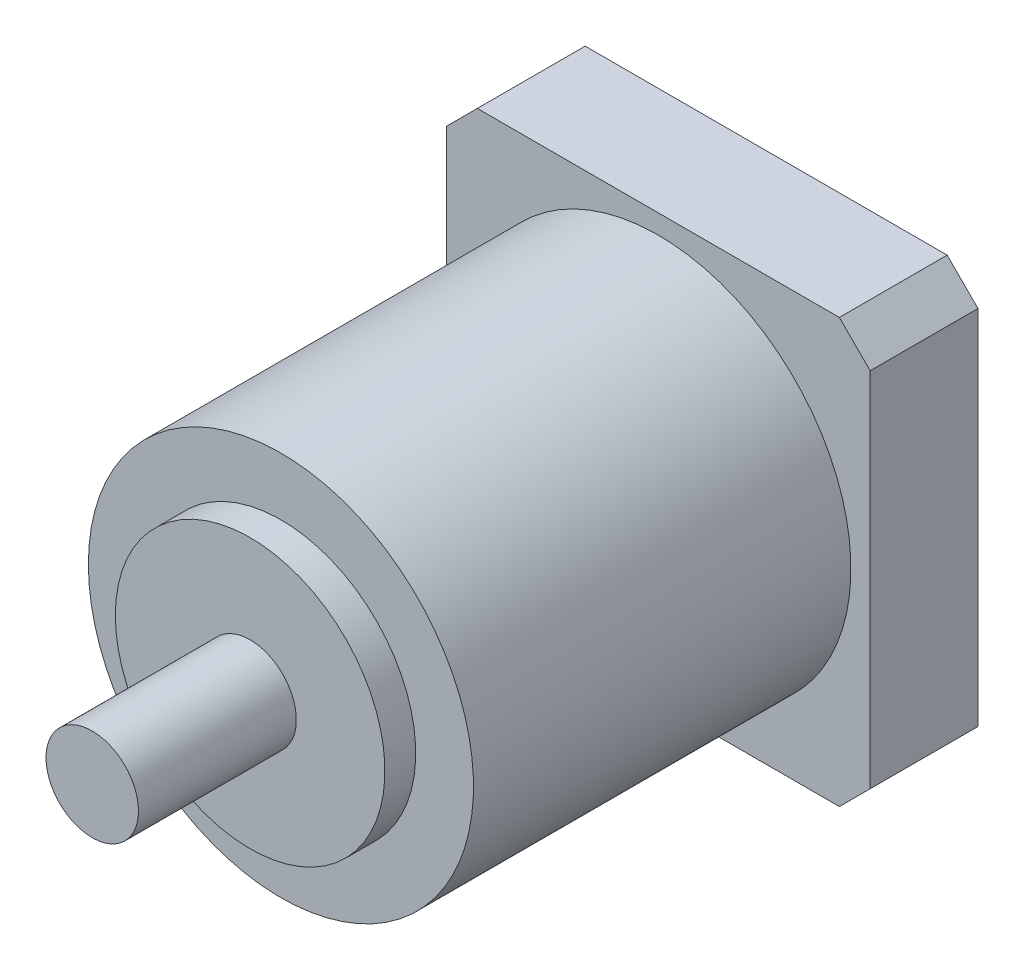
ISO-10303-21;
HEADER;
FILE_DESCRIPTION(('STEP AP214'),'2;1');
FILE_NAME('part.step','',(''),(''),'','','');
FILE_SCHEMA(('AUTOMOTIVE_DESIGN { 1 0 10303 214 1 1 1 1 }'));
ENDSEC;
DATA;
#1=APPLICATION_CONTEXT('core data for automotive mechanical design processes');
#2=APPLICATION_PROTOCOL_DEFINITION('international standard','automotive_design',2000,#1);
#3=PRODUCT_CONTEXT('',#1,'mechanical');
#4=PRODUCT('Part','Part','',(#3));
#5=PRODUCT_RELATED_PRODUCT_CATEGORY('part','',(#4));
#6=PRODUCT_DEFINITION_FORMATION('','',#4);
#7=PRODUCT_DEFINITION_CONTEXT('part definition',#1,'design');
#8=PRODUCT_DEFINITION('design','',#6,#7);
#9=PRODUCT_DEFINITION_SHAPE('','',#8);
#10=(LENGTH_UNIT() NAMED_UNIT(*) SI_UNIT(.MILLI.,.METRE.));
#11=(NAMED_UNIT(*) PLANE_ANGLE_UNIT() SI_UNIT($,.RADIAN.));
#12=(NAMED_UNIT(*) SI_UNIT($,.STERADIAN.) SOLID_ANGLE_UNIT());
#13=UNCERTAINTY_MEASURE_WITH_UNIT(LENGTH_MEASURE(1.E-05),#10,'distance_accuracy_value','');
#14=(GEOMETRIC_REPRESENTATION_CONTEXT(3) GLOBAL_UNCERTAINTY_ASSIGNED_CONTEXT((#13)) GLOBAL_UNIT_ASSIGNED_CONTEXT((#10,
#11,#12)) REPRESENTATION_CONTEXT('',''));
#15=CARTESIAN_POINT('',(0.,0.,0.));
#16=DIRECTION('',(0.,0.,1.));
#17=DIRECTION('',(1.,0.,0.));
#18=AXIS2_PLACEMENT_3D('',#15,#16,#17);
#19=CARTESIAN_POINT('',(0.,0.,-42.));
#20=DIRECTION('',(0.,0.,1.));
#21=DIRECTION('',(1.,0.,0.));
#22=AXIS2_PLACEMENT_3D('',#19,#20,#21);
#23=PLANE('',#22);
#24=CARTESIAN_POINT('',(0.,0.,-42.));
#25=DIRECTION('',(0.,0.,1.));
#26=DIRECTION('',(1.,0.,0.));
#27=AXIS2_PLACEMENT_3D('',#24,#25,#26);
#28=CIRCLE('',#27,4.5);
#29=CARTESIAN_POINT('',(4.5,0.,-42.));
#30=VERTEX_POINT('',#29);
#31=EDGE_CURVE('P0_E20',#30,#30,#28,.F.);
#32=ORIENTED_EDGE('',*,*,#31,.T.);
#33=EDGE_LOOP('',(#32));
#34=FACE_BOUND('',#33,.T.);
#35=ADVANCED_FACE('P0_F17',(#34),#23,.F.);
#36=CARTESIAN_POINT('',(0.,0.,-64.05));
#37=DIRECTION('',(0.,0.,1.));
#38=DIRECTION('',(1.,0.,0.));
#39=AXIS2_PLACEMENT_3D('',#36,#37,#38);
#40=CYLINDRICAL_SURFACE('',#39,4.5);
#41=CARTESIAN_POINT('',(0.,0.,-60.));
#42=DIRECTION('',(0.,0.,1.));
#43=DIRECTION('',(1.,0.,0.));
#44=AXIS2_PLACEMENT_3D('',#41,#42,#43);
#45=CIRCLE('',#44,4.5);
#46=CARTESIAN_POINT('',(4.5,0.,-60.));
#47=VERTEX_POINT('',#46);
#48=EDGE_CURVE('P0_E145',#47,#47,#45,.F.);
#49=ORIENTED_EDGE('',*,*,#48,.T.);
#50=EDGE_LOOP('',(#49));
#51=FACE_BOUND('',#50,.T.);
#52=ORIENTED_EDGE('',*,*,#31,.F.);
#53=EDGE_LOOP('',(#52));
#54=FACE_BOUND('',#53,.T.);
#55=ADVANCED_FACE('P0_F153',(#51,#54),#40,.F.);
#56=CARTESIAN_POINT('',(0.,0.,24.5));
#57=DIRECTION('',(0.,0.,-1.));
#58=DIRECTION('',(-1.,0.,0.));
#59=AXIS2_PLACEMENT_3D('',#56,#57,#58);
#60=PLANE('',#59);
#61=CARTESIAN_POINT('',(0.,0.,24.5));
#62=DIRECTION('',(0.,0.,-1.));
#63=DIRECTION('',(-1.,0.,0.));
#64=AXIS2_PLACEMENT_3D('',#61,#62,#63);
#65=CIRCLE('',#64,6.);
#66=CARTESIAN_POINT('',(-6.,0.,24.5));
#67=VERTEX_POINT('',#66);
#68=EDGE_CURVE('P0_E109',#67,#67,#65,.T.);
#69=ORIENTED_EDGE('',*,*,#68,.F.);
#70=EDGE_LOOP('',(#69));
#71=FACE_BOUND('',#70,.T.);
#72=ADVANCED_FACE('P0_F155',(#71),#60,.F.);
#73=CARTESIAN_POINT('',(0.,0.,-60.));
#74=DIRECTION('',(0.,0.,1.));
#75=DIRECTION('',(1.,0.,0.));
#76=AXIS2_PLACEMENT_3D('',#73,#74,#75);
#77=PLANE('',#76);
#78=ORIENTED_EDGE('',*,*,#48,.F.);
#79=EDGE_LOOP('',(#78));
#80=FACE_BOUND('',#79,.T.);
#81=CARTESIAN_POINT('',(0.,0.,-60.));
#82=DIRECTION('',(0.,0.,1.));
#83=DIRECTION('',(1.,0.,0.));
#84=AXIS2_PLACEMENT_3D('',#81,#82,#83);
#85=CIRCLE('',#84,20.5);
#86=CARTESIAN_POINT('',(20.5,0.,-60.));
#87=VERTEX_POINT('',#86);
#88=EDGE_CURVE('P0_E103',#87,#87,#85,.F.);
#89=ORIENTED_EDGE('',*,*,#88,.T.);
#90=EDGE_LOOP('',(#89));
#91=FACE_BOUND('',#90,.T.);
#92=ADVANCED_FACE('P0_F96',(#80,#91),#77,.F.);
#93=CARTESIAN_POINT('',(-22.27386360738,22.27386360738,-54.0000000000305));
#94=DIRECTION('',(0.,0.,-1.));
#95=DIRECTION('',(0.,1.,0.));
#96=AXIS2_PLACEMENT_3D('',#93,#94,#95);
#97=CONICAL_SURFACE('',#96,1.5999999999949,1.0297442586517);
#98=CARTESIAN_POINT('',(-22.2738636073245,22.27386360738,-53.0386230095985));
#99=VERTEX_POINT('',#98);
#100=VERTEX_LOOP('',#99);
#101=FACE_BOUND('',#100,.T.);
#102=CARTESIAN_POINT('',(-22.27386360738,22.27386360738,-54.));
#103=DIRECTION('',(0.,0.,-1.));
#104=DIRECTION('',(-1.,0.,0.));
#105=AXIS2_PLACEMENT_3D('',#102,#103,#104);
#106=CIRCLE('',#105,1.6);
#107=CARTESIAN_POINT('',(-23.87386360738,22.27386360738,-54.));
#108=VERTEX_POINT('',#107);
#109=EDGE_CURVE('P0_E100',#108,#108,#106,.T.);
#110=ORIENTED_EDGE('',*,*,#109,.T.);
#111=EDGE_LOOP('',(#110));
#112=FACE_BOUND('',#111,.T.);
#113=ADVANCED_FACE('P0_F92',(#101,#112),#97,.F.);
#114=CARTESIAN_POINT('',(22.27386360738,22.27386360738,-54.0000000000873));
#115=DIRECTION('',(0.,0.,-1.));
#116=DIRECTION('',(-1.,0.,0.));
#117=AXIS2_PLACEMENT_3D('',#114,#115,#116);
#118=CONICAL_SURFACE('',#117,1.5999999999408,1.02974425855395);
#119=CARTESIAN_POINT('',(22.2738636074382,22.27386360738,-53.0386230095985));
#120=VERTEX_POINT('',#119);
#121=VERTEX_LOOP('',#120);
#122=FACE_BOUND('',#121,.T.);
#123=CARTESIAN_POINT('',(22.27386360738,22.27386360738,-54.));
#124=DIRECTION('',(0.,0.,-1.));
#125=DIRECTION('',(-1.,0.,0.));
#126=AXIS2_PLACEMENT_3D('',#123,#124,#125);
#127=CIRCLE('',#126,1.6);
#128=CARTESIAN_POINT('',(20.67386360738,22.27386360738,-54.));
#129=VERTEX_POINT('',#128);
#130=EDGE_CURVE('P0_E102',#129,#129,#127,.T.);
#131=ORIENTED_EDGE('',*,*,#130,.T.);
#132=EDGE_LOOP('',(#131));
#133=FACE_BOUND('',#132,.T.);
#134=ADVANCED_FACE('P0_F95',(#122,#133),#118,.F.);
#135=CARTESIAN_POINT('',(22.27386360738,-22.27386360738,-54.0000000000873));
#136=DIRECTION('',(0.,0.,-1.));
#137=DIRECTION('',(-1.,0.,0.));
#138=AXIS2_PLACEMENT_3D('',#135,#136,#137);
#139=CONICAL_SURFACE('',#138,1.5999999999408,1.02974425855395);
#140=CARTESIAN_POINT('',(22.2738636074382,-22.27386360738,-53.0386230095985));
#141=VERTEX_POINT('',#140);
#142=VERTEX_LOOP('',#141);
#143=FACE_BOUND('',#142,.T.);
#144=CARTESIAN_POINT('',(22.27386360738,-22.27386360738,-54.));
#145=DIRECTION('',(0.,0.,-1.));
#146=DIRECTION('',(-1.,0.,0.));
#147=AXIS2_PLACEMENT_3D('',#144,#145,#146);
#148=CIRCLE('',#147,1.6);
#149=CARTESIAN_POINT('',(20.67386360738,-22.27386360738,-54.));
#150=VERTEX_POINT('',#149);
#151=EDGE_CURVE('P0_E106',#150,#150,#148,.T.);
#152=ORIENTED_EDGE('',*,*,#151,.T.);
#153=EDGE_LOOP('',(#152));
#154=FACE_BOUND('',#153,.T.);
#155=ADVANCED_FACE('P0_F248',(#143,#154),#139,.F.);
#156=CARTESIAN_POINT('',(-22.27386360738,-22.27386360738,-54.0000000000305));
#157=DIRECTION('',(0.,0.,-1.));
#158=DIRECTION('',(0.,1.,0.));
#159=AXIS2_PLACEMENT_3D('',#156,#157,#158);
#160=CONICAL_SURFACE('',#159,1.5999999999949,1.0297442586517);
#161=CARTESIAN_POINT('',(-22.2738636073245,-22.27386360738,-53.0386230095985));
#162=VERTEX_POINT('',#161);
#163=VERTEX_LOOP('',#162);
#164=FACE_BOUND('',#163,.T.);
#165=CARTESIAN_POINT('',(-22.27386360738,-22.27386360738,-54.));
#166=DIRECTION('',(0.,0.,-1.));
#167=DIRECTION('',(-1.,0.,0.));
#168=AXIS2_PLACEMENT_3D('',#165,#166,#167);
#169=CIRCLE('',#168,1.6);
#170=CARTESIAN_POINT('',(-23.87386360738,-22.27386360738,-54.));
#171=VERTEX_POINT('',#170);
#172=EDGE_CURVE('P0_E142',#171,#171,#169,.T.);
#173=ORIENTED_EDGE('',*,*,#172,.T.);
#174=EDGE_LOOP('',(#173));
#175=FACE_BOUND('',#174,.T.);
#176=ADVANCED_FACE('P0_F244',(#164,#175),#160,.F.);
#177=CARTESIAN_POINT('',(0.,0.,25.725));
#178=DIRECTION('',(0.,0.,-1.));
#179=DIRECTION('',(-1.,0.,0.));
#180=AXIS2_PLACEMENT_3D('',#177,#178,#179);
#181=CYLINDRICAL_SURFACE('',#180,6.);
#182=CARTESIAN_POINT('',(0.,0.,4.));
#183=DIRECTION('',(0.,0.,-1.));
#184=DIRECTION('',(-1.,0.,0.));
#185=AXIS2_PLACEMENT_3D('',#182,#183,#184);
#186=CIRCLE('',#185,6.);
#187=CARTESIAN_POINT('',(-6.,0.,4.));
#188=VERTEX_POINT('',#187);
#189=EDGE_CURVE('P0_E140',#188,#188,#186,.F.);
#190=ORIENTED_EDGE('',*,*,#189,.T.);
#191=EDGE_LOOP('',(#190));
#192=FACE_BOUND('',#191,.T.);
#193=ORIENTED_EDGE('',*,*,#68,.T.);
#194=EDGE_LOOP('',(#193));
#195=FACE_BOUND('',#194,.T.);
#196=ADVANCED_FACE('P0_F240',(#192,#195),#181,.T.);
#197=CARTESIAN_POINT('',(0.,0.,-64.05));
#198=DIRECTION('',(0.,0.,1.));
#199=DIRECTION('',(1.,0.,0.));
#200=AXIS2_PLACEMENT_3D('',#197,#198,#199);
#201=CYLINDRICAL_SURFACE('',#200,20.5);
#202=ORIENTED_EDGE('',*,*,#88,.F.);
#203=EDGE_LOOP('',(#202));
#204=FACE_BOUND('',#203,.T.);
#205=CARTESIAN_POINT('',(0.,0.,-63.));
#206=DIRECTION('',(0.,0.,1.));
#207=DIRECTION('',(1.,0.,0.));
#208=AXIS2_PLACEMENT_3D('',#205,#206,#207);
#209=CIRCLE('',#208,20.5);
#210=CARTESIAN_POINT('',(20.5,0.,-63.));
#211=VERTEX_POINT('',#210);
#212=EDGE_CURVE('P0_E137',#211,#211,#209,.T.);
#213=ORIENTED_EDGE('',*,*,#212,.F.);
#214=EDGE_LOOP('',(#213));
#215=FACE_BOUND('',#214,.T.);
#216=ADVANCED_FACE('P0_F237',(#204,#215),#201,.F.);
#217=CARTESIAN_POINT('',(-22.27386360738,22.27386360738,-52.54055416003));
#218=DIRECTION('',(0.,0.,-1.));
#219=DIRECTION('',(-1.,0.,0.));
#220=AXIS2_PLACEMENT_3D('',#217,#218,#219);
#221=CYLINDRICAL_SURFACE('',#220,1.6);
#222=ORIENTED_EDGE('',*,*,#109,.F.);
#223=EDGE_LOOP('',(#222));
#224=FACE_BOUND('',#223,.T.);
#225=CARTESIAN_POINT('',(-22.27386360738,22.27386360738,-63.));
#226=DIRECTION('',(0.,0.,-1.));
#227=DIRECTION('',(-1.,0.,0.));
#228=AXIS2_PLACEMENT_3D('',#225,#226,#227);
#229=CIRCLE('',#228,1.6);
#230=CARTESIAN_POINT('',(-23.87386360738,22.27386360738,-63.));
#231=VERTEX_POINT('',#230);
#232=EDGE_CURVE('P0_E134',#231,#231,#229,.F.);
#233=ORIENTED_EDGE('',*,*,#232,.F.);
#234=EDGE_LOOP('',(#233));
#235=FACE_BOUND('',#234,.T.);
#236=ADVANCED_FACE('P0_F233',(#224,#235),#221,.F.);
#237=CARTESIAN_POINT('',(22.27386360738,22.27386360738,-52.54055416003));
#238=DIRECTION('',(0.,0.,-1.));
#239=DIRECTION('',(-1.,0.,0.));
#240=AXIS2_PLACEMENT_3D('',#237,#238,#239);
#241=CYLINDRICAL_SURFACE('',#240,1.6);
#242=ORIENTED_EDGE('',*,*,#130,.F.);
#243=EDGE_LOOP('',(#242));
#244=FACE_BOUND('',#243,.T.);
#245=CARTESIAN_POINT('',(22.27386360738,22.27386360738,-63.));
#246=DIRECTION('',(0.,0.,-1.));
#247=DIRECTION('',(-1.,0.,0.));
#248=AXIS2_PLACEMENT_3D('',#245,#246,#247);
#249=CIRCLE('',#248,1.6);
#250=CARTESIAN_POINT('',(20.67386360738,22.27386360738,-63.));
#251=VERTEX_POINT('',#250);
#252=EDGE_CURVE('P0_E131',#251,#251,#249,.F.);
#253=ORIENTED_EDGE('',*,*,#252,.F.);
#254=EDGE_LOOP('',(#253));
#255=FACE_BOUND('',#254,.T.);
#256=ADVANCED_FACE('P0_F229',(#244,#255),#241,.F.);
#257=CARTESIAN_POINT('',(22.27386360738,-22.27386360738,-52.54055416003));
#258=DIRECTION('',(0.,0.,-1.));
#259=DIRECTION('',(-1.,0.,0.));
#260=AXIS2_PLACEMENT_3D('',#257,#258,#259);
#261=CYLINDRICAL_SURFACE('',#260,1.6);
#262=ORIENTED_EDGE('',*,*,#151,.F.);
#263=EDGE_LOOP('',(#262));
#264=FACE_BOUND('',#263,.T.);
#265=CARTESIAN_POINT('',(22.27386360738,-22.27386360738,-63.));
#266=DIRECTION('',(0.,0.,-1.));
#267=DIRECTION('',(-1.,0.,0.));
#268=AXIS2_PLACEMENT_3D('',#265,#266,#267);
#269=CIRCLE('',#268,1.6);
#270=CARTESIAN_POINT('',(20.67386360738,-22.27386360738,-63.));
#271=VERTEX_POINT('',#270);
#272=EDGE_CURVE('P0_E128',#271,#271,#269,.F.);
#273=ORIENTED_EDGE('',*,*,#272,.F.);
#274=EDGE_LOOP('',(#273));
#275=FACE_BOUND('',#274,.T.);
#276=ADVANCED_FACE('P0_F225',(#264,#275),#261,.F.);
#277=CARTESIAN_POINT('',(-22.27386360738,-22.27386360738,-52.54055416003));
#278=DIRECTION('',(0.,0.,-1.));
#279=DIRECTION('',(-1.,0.,0.));
#280=AXIS2_PLACEMENT_3D('',#277,#278,#279);
#281=CYLINDRICAL_SURFACE('',#280,1.6);
#282=ORIENTED_EDGE('',*,*,#172,.F.);
#283=EDGE_LOOP('',(#282));
#284=FACE_BOUND('',#283,.T.);
#285=CARTESIAN_POINT('',(-22.27386360738,-22.27386360738,-63.));
#286=DIRECTION('',(0.,0.,-1.));
#287=DIRECTION('',(-1.,0.,0.));
#288=AXIS2_PLACEMENT_3D('',#285,#286,#287);
#289=CIRCLE('',#288,1.6);
#290=CARTESIAN_POINT('',(-23.87386360738,-22.27386360738,-63.));
#291=VERTEX_POINT('',#290);
#292=EDGE_CURVE('P0_E125',#291,#291,#289,.F.);
#293=ORIENTED_EDGE('',*,*,#292,.F.);
#294=EDGE_LOOP('',(#293));
#295=FACE_BOUND('',#294,.T.);
#296=ADVANCED_FACE('P0_F221',(#284,#295),#281,.F.);
#297=CARTESIAN_POINT('',(0.,0.,4.));
#298=DIRECTION('',(0.,0.,-1.));
#299=DIRECTION('',(-1.,0.,0.));
#300=AXIS2_PLACEMENT_3D('',#297,#298,#299);
#301=PLANE('',#300);
#302=ORIENTED_EDGE('',*,*,#189,.F.);
#303=EDGE_LOOP('',(#302));
#304=FACE_BOUND('',#303,.T.);
#305=CARTESIAN_POINT('',(0.,0.,4.));
#306=DIRECTION('',(0.,0.,-1.));
#307=DIRECTION('',(-1.,0.,0.));
#308=AXIS2_PLACEMENT_3D('',#305,#306,#307);
#309=CIRCLE('',#308,17.5);
#310=CARTESIAN_POINT('',(-17.5,0.,4.));
#311=VERTEX_POINT('',#310);
#312=EDGE_CURVE('P0_E121',#311,#311,#309,.T.);
#313=ORIENTED_EDGE('',*,*,#312,.F.);
#314=EDGE_LOOP('',(#313));
#315=FACE_BOUND('',#314,.T.);
#316=ADVANCED_FACE('P0_F217',(#304,#315),#301,.F.);
#317=CARTESIAN_POINT('',(0.,0.,-63.));
#318=DIRECTION('',(0.,0.,-1.));
#319=DIRECTION('',(-1.,0.,0.));
#320=AXIS2_PLACEMENT_3D('',#317,#318,#319);
#321=PLANE('',#320);
#322=ORIENTED_EDGE('',*,*,#292,.T.);
#323=EDGE_LOOP('',(#322));
#324=FACE_BOUND('',#323,.T.);
#325=ORIENTED_EDGE('',*,*,#272,.T.);
#326=EDGE_LOOP('',(#325));
#327=FACE_BOUND('',#326,.T.);
#328=ORIENTED_EDGE('',*,*,#252,.T.);
#329=EDGE_LOOP('',(#328));
#330=FACE_BOUND('',#329,.T.);
#331=ORIENTED_EDGE('',*,*,#232,.T.);
#332=EDGE_LOOP('',(#331));
#333=FACE_BOUND('',#332,.T.);
#334=ORIENTED_EDGE('',*,*,#212,.T.);
#335=EDGE_LOOP('',(#334));
#336=FACE_BOUND('',#335,.T.);
#337=DIRECTION('',(0.707106781186548,0.707106781186548,0.));
#338=VECTOR('',#337,1.);
#339=CARTESIAN_POINT('',(23.5,-27.5,-63.));
#340=LINE('',#339,#338);
#341=CARTESIAN_POINT('',(23.5,-27.5,-63.));
#342=VERTEX_POINT('',#341);
#343=CARTESIAN_POINT('',(27.5,-23.5,-63.));
#344=VERTEX_POINT('',#343);
#345=EDGE_CURVE('P0_E266',#342,#344,#340,.T.);
#346=ORIENTED_EDGE('',*,*,#345,.F.);
#347=DIRECTION('',(1.,0.,0.));
#348=VECTOR('',#347,1.);
#349=CARTESIAN_POINT('',(27.5,-27.5,-63.));
#350=LINE('',#349,#348);
#351=CARTESIAN_POINT('',(-23.5,-27.5,-63.));
#352=VERTEX_POINT('',#351);
#353=EDGE_CURVE('P0_E124',#352,#342,#350,.T.);
#354=ORIENTED_EDGE('',*,*,#353,.F.);
#355=DIRECTION('',(0.707106781186548,-0.707106781186548,0.));
#356=VECTOR('',#355,1.);
#357=CARTESIAN_POINT('',(-27.5,-23.5,-63.));
#358=LINE('',#357,#356);
#359=CARTESIAN_POINT('',(-27.5,-23.5,-63.));
#360=VERTEX_POINT('',#359);
#361=EDGE_CURVE('P0_E279',#360,#352,#358,.T.);
#362=ORIENTED_EDGE('',*,*,#361,.F.);
#363=DIRECTION('',(0.,1.,0.));
#364=VECTOR('',#363,1.);
#365=CARTESIAN_POINT('',(-27.5,-27.5,-63.));
#366=LINE('',#365,#364);
#367=CARTESIAN_POINT('',(-27.5,23.5,-63.));
#368=VERTEX_POINT('',#367);
#369=EDGE_CURVE('P0_E311',#368,#360,#366,.F.);
#370=ORIENTED_EDGE('',*,*,#369,.F.);
#371=DIRECTION('',(-0.707106781186548,-0.707106781186548,0.));
#372=VECTOR('',#371,1.);
#373=CARTESIAN_POINT('',(-23.5,27.5,-63.));
#374=LINE('',#373,#372);
#375=CARTESIAN_POINT('',(-23.5,27.5,-63.));
#376=VERTEX_POINT('',#375);
#377=EDGE_CURVE('P0_E305',#376,#368,#374,.T.);
#378=ORIENTED_EDGE('',*,*,#377,.F.);
#379=DIRECTION('',(1.,0.,0.));
#380=VECTOR('',#379,1.);
#381=CARTESIAN_POINT('',(-27.5,27.5,-63.));
#382=LINE('',#381,#380);
#383=CARTESIAN_POINT('',(23.5,27.5,-63.));
#384=VERTEX_POINT('',#383);
#385=EDGE_CURVE('P0_E299',#384,#376,#382,.F.);
#386=ORIENTED_EDGE('',*,*,#385,.F.);
#387=DIRECTION('',(-0.707106781186548,0.707106781186548,0.));
#388=VECTOR('',#387,1.);
#389=CARTESIAN_POINT('',(27.5,23.5,-63.));
#390=LINE('',#389,#388);
#391=CARTESIAN_POINT('',(27.5,23.5,-63.));
#392=VERTEX_POINT('',#391);
#393=EDGE_CURVE('P0_E293',#392,#384,#390,.T.);
#394=ORIENTED_EDGE('',*,*,#393,.F.);
#395=DIRECTION('',(0.,1.,0.));
#396=VECTOR('',#395,1.);
#397=CARTESIAN_POINT('',(27.5,27.5,-63.));
#398=LINE('',#397,#396);
#399=EDGE_CURVE('P0_E270',#344,#392,#398,.T.);
#400=ORIENTED_EDGE('',*,*,#399,.F.);
#401=EDGE_LOOP('',(#346,#354,#362,#370,#378,#386,#394,#400));
#402=FACE_BOUND('',#401,.T.);
#403=ADVANCED_FACE('P0_F213',(#324,#327,#330,#333,#336,#402),#321,.T.);
#404=CARTESIAN_POINT('',(0.,0.,25.725));
#405=DIRECTION('',(0.,0.,-1.));
#406=DIRECTION('',(-1.,0.,0.));
#407=AXIS2_PLACEMENT_3D('',#404,#405,#406);
#408=CYLINDRICAL_SURFACE('',#407,17.5);
#409=ORIENTED_EDGE('',*,*,#312,.T.);
#410=EDGE_LOOP('',(#409));
#411=FACE_BOUND('',#410,.T.);
#412=CARTESIAN_POINT('',(0.,0.,0.));
#413=DIRECTION('',(0.,0.,-1.));
#414=DIRECTION('',(-1.,0.,0.));
#415=AXIS2_PLACEMENT_3D('',#412,#413,#414);
#416=CIRCLE('',#415,17.5);
#417=CARTESIAN_POINT('',(-17.5,0.,0.));
#418=VERTEX_POINT('',#417);
#419=EDGE_CURVE('P0_E116',#418,#418,#416,.F.);
#420=ORIENTED_EDGE('',*,*,#419,.T.);
#421=EDGE_LOOP('',(#420));
#422=FACE_BOUND('',#421,.T.);
#423=ADVANCED_FACE('P0_F209',(#411,#422),#408,.T.);
#424=CARTESIAN_POINT('',(27.5,-27.5,-49.));
#425=DIRECTION('',(0.,-1.,0.));
#426=DIRECTION('',(0.,0.,-1.));
#427=AXIS2_PLACEMENT_3D('',#424,#425,#426);
#428=PLANE('',#427);
#429=DIRECTION('',(0.,0.,1.));
#430=VECTOR('',#429,1.);
#431=CARTESIAN_POINT('',(23.5,-27.5,-49.));
#432=LINE('',#431,#430);
#433=CARTESIAN_POINT('',(23.5,-27.5,-49.));
#434=VERTEX_POINT('',#433);
#435=EDGE_CURVE('P0_E120',#434,#342,#432,.F.);
#436=ORIENTED_EDGE('',*,*,#435,.F.);
#437=DIRECTION('',(-1.,0.,0.));
#438=VECTOR('',#437,1.);
#439=CARTESIAN_POINT('',(0.,-27.5,-49.));
#440=LINE('',#439,#438);
#441=CARTESIAN_POINT('',(-23.5,-27.5,-49.));
#442=VERTEX_POINT('',#441);
#443=EDGE_CURVE('P0_E119',#434,#442,#440,.T.);
#444=ORIENTED_EDGE('',*,*,#443,.T.);
#445=DIRECTION('',(0.,0.,1.));
#446=VECTOR('',#445,1.);
#447=CARTESIAN_POINT('',(-23.5,-27.5,-49.));
#448=LINE('',#447,#446);
#449=EDGE_CURVE('P0_E277',#352,#442,#448,.T.);
#450=ORIENTED_EDGE('',*,*,#449,.F.);
#451=ORIENTED_EDGE('',*,*,#353,.T.);
#452=EDGE_LOOP('',(#436,#444,#450,#451));
#453=FACE_BOUND('',#452,.T.);
#454=ADVANCED_FACE('P0_F205',(#453),#428,.T.);
#455=CARTESIAN_POINT('',(-27.5,-23.5,-49.));
#456=DIRECTION('',(-0.707106781186548,-0.707106781186548,0.));
#457=DIRECTION('',(0.707106781186548,-0.707106781186548,0.));
#458=AXIS2_PLACEMENT_3D('',#455,#456,#457);
#459=PLANE('',#458);
#460=DIRECTION('',(-0.707106781186548,0.707106781186548,0.));
#461=VECTOR('',#460,1.);
#462=CARTESIAN_POINT('',(-23.5,-27.5,-49.));
#463=LINE('',#462,#461);
#464=CARTESIAN_POINT('',(-27.5,-23.5,-49.));
#465=VERTEX_POINT('',#464);
#466=EDGE_CURVE('P0_E354',#442,#465,#463,.T.);
#467=ORIENTED_EDGE('',*,*,#466,.T.);
#468=DIRECTION('',(0.,0.,1.));
#469=VECTOR('',#468,1.);
#470=CARTESIAN_POINT('',(-27.5,-23.5,-49.));
#471=LINE('',#470,#469);
#472=EDGE_CURVE('P0_E308',#360,#465,#471,.T.);
#473=ORIENTED_EDGE('',*,*,#472,.F.);
#474=ORIENTED_EDGE('',*,*,#361,.T.);
#475=ORIENTED_EDGE('',*,*,#449,.T.);
#476=EDGE_LOOP('',(#467,#473,#474,#475));
#477=FACE_BOUND('',#476,.T.);
#478=ADVANCED_FACE('P0_F201',(#477),#459,.T.);
#479=CARTESIAN_POINT('',(-27.5,-27.5,-49.));
#480=DIRECTION('',(-1.,0.,0.));
#481=DIRECTION('',(0.,0.,1.));
#482=AXIS2_PLACEMENT_3D('',#479,#480,#481);
#483=PLANE('',#482);
#484=ORIENTED_EDGE('',*,*,#472,.T.);
#485=DIRECTION('',(0.,1.,0.));
#486=VECTOR('',#485,1.);
#487=CARTESIAN_POINT('',(-27.5,0.,-49.));
#488=LINE('',#487,#486);
#489=CARTESIAN_POINT('',(-27.5,23.5,-49.));
#490=VERTEX_POINT('',#489);
#491=EDGE_CURVE('P0_E338',#465,#490,#488,.T.);
#492=ORIENTED_EDGE('',*,*,#491,.T.);
#493=DIRECTION('',(0.,0.,1.));
#494=VECTOR('',#493,1.);
#495=CARTESIAN_POINT('',(-27.5,23.5,-49.));
#496=LINE('',#495,#494);
#497=EDGE_CURVE('P0_E302',#368,#490,#496,.T.);
#498=ORIENTED_EDGE('',*,*,#497,.F.);
#499=ORIENTED_EDGE('',*,*,#369,.T.);
#500=EDGE_LOOP('',(#484,#492,#498,#499));
#501=FACE_BOUND('',#500,.T.);
#502=ADVANCED_FACE('P0_F197',(#501),#483,.T.);
#503=CARTESIAN_POINT('',(-23.5,27.5,-49.));
#504=DIRECTION('',(-0.707106781186548,0.707106781186548,0.));
#505=DIRECTION('',(-0.707106781186548,-0.707106781186548,0.));
#506=AXIS2_PLACEMENT_3D('',#503,#504,#505);
#507=PLANE('',#506);
#508=DIRECTION('',(0.707106781186548,0.707106781186548,0.));
#509=VECTOR('',#508,1.);
#510=CARTESIAN_POINT('',(-27.5,23.5,-49.));
#511=LINE('',#510,#509);
#512=CARTESIAN_POINT('',(-23.5,27.5,-49.));
#513=VERTEX_POINT('',#512);
#514=EDGE_CURVE('P0_E340',#490,#513,#511,.T.);
#515=ORIENTED_EDGE('',*,*,#514,.T.);
#516=DIRECTION('',(0.,0.,1.));
#517=VECTOR('',#516,1.);
#518=CARTESIAN_POINT('',(-23.5,27.5,-49.));
#519=LINE('',#518,#517);
#520=EDGE_CURVE('P0_E296',#376,#513,#519,.T.);
#521=ORIENTED_EDGE('',*,*,#520,.F.);
#522=ORIENTED_EDGE('',*,*,#377,.T.);
#523=ORIENTED_EDGE('',*,*,#497,.T.);
#524=EDGE_LOOP('',(#515,#521,#522,#523));
#525=FACE_BOUND('',#524,.T.);
#526=ADVANCED_FACE('P0_F193',(#525),#507,.T.);
#527=CARTESIAN_POINT('',(-27.5,27.5,-49.));
#528=DIRECTION('',(0.,1.,0.));
#529=DIRECTION('',(0.,0.,1.));
#530=AXIS2_PLACEMENT_3D('',#527,#528,#529);
#531=PLANE('',#530);
#532=ORIENTED_EDGE('',*,*,#520,.T.);
#533=DIRECTION('',(-1.,0.,0.));
#534=VECTOR('',#533,1.);
#535=CARTESIAN_POINT('',(0.,27.5,-49.));
#536=LINE('',#535,#534);
#537=CARTESIAN_POINT('',(23.5,27.5,-49.));
#538=VERTEX_POINT('',#537);
#539=EDGE_CURVE('P0_E351',#513,#538,#536,.F.);
#540=ORIENTED_EDGE('',*,*,#539,.T.);
#541=DIRECTION('',(0.,0.,1.));
#542=VECTOR('',#541,1.);
#543=CARTESIAN_POINT('',(23.5,27.5,-49.));
#544=LINE('',#543,#542);
#545=EDGE_CURVE('P0_E290',#384,#538,#544,.T.);
#546=ORIENTED_EDGE('',*,*,#545,.F.);
#547=ORIENTED_EDGE('',*,*,#385,.T.);
#548=EDGE_LOOP('',(#532,#540,#546,#547));
#549=FACE_BOUND('',#548,.T.);
#550=ADVANCED_FACE('P0_F189',(#549),#531,.T.);
#551=CARTESIAN_POINT('',(27.5,23.5,-49.));
#552=DIRECTION('',(0.707106781186548,0.707106781186548,0.));
#553=DIRECTION('',(-0.707106781186548,0.707106781186548,0.));
#554=AXIS2_PLACEMENT_3D('',#551,#552,#553);
#555=PLANE('',#554);
#556=DIRECTION('',(0.707106781186548,-0.707106781186548,0.));
#557=VECTOR('',#556,1.);
#558=CARTESIAN_POINT('',(23.5,27.5,-49.));
#559=LINE('',#558,#557);
#560=CARTESIAN_POINT('',(27.5,23.5,-49.));
#561=VERTEX_POINT('',#560);
#562=EDGE_CURVE('P0_E345',#538,#561,#559,.T.);
#563=ORIENTED_EDGE('',*,*,#562,.T.);
#564=DIRECTION('',(0.,0.,-1.));
#565=VECTOR('',#564,1.);
#566=CARTESIAN_POINT('',(27.5,23.5,-49.));
#567=LINE('',#566,#565);
#568=EDGE_CURVE('P0_E273',#392,#561,#567,.F.);
#569=ORIENTED_EDGE('',*,*,#568,.F.);
#570=ORIENTED_EDGE('',*,*,#393,.T.);
#571=ORIENTED_EDGE('',*,*,#545,.T.);
#572=EDGE_LOOP('',(#563,#569,#570,#571));
#573=FACE_BOUND('',#572,.T.);
#574=ADVANCED_FACE('P0_F186',(#573),#555,.T.);
#575=CARTESIAN_POINT('',(27.5,27.5,-49.));
#576=DIRECTION('',(1.,0.,0.));
#577=DIRECTION('',(0.,0.,-1.));
#578=AXIS2_PLACEMENT_3D('',#575,#576,#577);
#579=PLANE('',#578);
#580=ORIENTED_EDGE('',*,*,#568,.T.);
#581=DIRECTION('',(0.,1.,0.));
#582=VECTOR('',#581,1.);
#583=CARTESIAN_POINT('',(27.5,0.,-49.));
#584=LINE('',#583,#582);
#585=CARTESIAN_POINT('',(27.5,-23.5,-49.));
#586=VERTEX_POINT('',#585);
#587=EDGE_CURVE('P0_E35',#561,#586,#584,.F.);
#588=ORIENTED_EDGE('',*,*,#587,.T.);
#589=DIRECTION('',(0.,0.,1.));
#590=VECTOR('',#589,1.);
#591=CARTESIAN_POINT('',(27.5,-23.5,-49.));
#592=LINE('',#591,#590);
#593=EDGE_CURVE('P0_E272',#344,#586,#592,.T.);
#594=ORIENTED_EDGE('',*,*,#593,.F.);
#595=ORIENTED_EDGE('',*,*,#399,.T.);
#596=EDGE_LOOP('',(#580,#588,#594,#595));
#597=FACE_BOUND('',#596,.T.);
#598=ADVANCED_FACE('P0_F182',(#597),#579,.T.);
#599=CARTESIAN_POINT('',(23.5,-27.5,-49.));
#600=DIRECTION('',(0.707106781186548,-0.707106781186548,0.));
#601=DIRECTION('',(0.707106781186548,0.707106781186548,0.));
#602=AXIS2_PLACEMENT_3D('',#599,#600,#601);
#603=PLANE('',#602);
#604=DIRECTION('',(-0.707106781186548,-0.707106781186548,0.));
#605=VECTOR('',#604,1.);
#606=CARTESIAN_POINT('',(27.5,-23.5,-49.));
#607=LINE('',#606,#605);
#608=EDGE_CURVE('P0_E115',#586,#434,#607,.T.);
#609=ORIENTED_EDGE('',*,*,#608,.T.);
#610=ORIENTED_EDGE('',*,*,#435,.T.);
#611=ORIENTED_EDGE('',*,*,#345,.T.);
#612=ORIENTED_EDGE('',*,*,#593,.T.);
#613=EDGE_LOOP('',(#609,#610,#611,#612));
#614=FACE_BOUND('',#613,.T.);
#615=ADVANCED_FACE('P0_F178',(#614),#603,.T.);
#616=CARTESIAN_POINT('',(0.,0.,0.));
#617=DIRECTION('',(0.,0.,-1.));
#618=DIRECTION('',(-1.,0.,0.));
#619=AXIS2_PLACEMENT_3D('',#616,#617,#618);
#620=PLANE('',#619);
#621=ORIENTED_EDGE('',*,*,#419,.F.);
#622=EDGE_LOOP('',(#621));
#623=FACE_BOUND('',#622,.T.);
#624=CARTESIAN_POINT('',(0.,0.,0.));
#625=DIRECTION('',(0.,0.,-1.));
#626=DIRECTION('',(-1.,0.,0.));
#627=AXIS2_PLACEMENT_3D('',#624,#625,#626);
#628=CIRCLE('',#627,25.);
#629=CARTESIAN_POINT('',(-25.,0.,0.));
#630=VERTEX_POINT('',#629);
#631=EDGE_CURVE('P0_E26',#630,#630,#628,.T.);
#632=ORIENTED_EDGE('',*,*,#631,.F.);
#633=EDGE_LOOP('',(#632));
#634=FACE_BOUND('',#633,.T.);
#635=ADVANCED_FACE('P0_F171',(#623,#634),#620,.F.);
#636=CARTESIAN_POINT('',(0.,0.,-49.));
#637=DIRECTION('',(0.,0.,-1.));
#638=DIRECTION('',(-1.,0.,0.));
#639=AXIS2_PLACEMENT_3D('',#636,#637,#638);
#640=PLANE('',#639);
#641=CARTESIAN_POINT('',(0.,0.,-49.));
#642=DIRECTION('',(0.,0.,-1.));
#643=DIRECTION('',(-1.,0.,0.));
#644=AXIS2_PLACEMENT_3D('',#641,#642,#643);
#645=CIRCLE('',#644,25.);
#646=CARTESIAN_POINT('',(-25.,0.,-49.));
#647=VERTEX_POINT('',#646);
#648=EDGE_CURVE('P0_E11',#647,#647,#645,.F.);
#649=ORIENTED_EDGE('',*,*,#648,.F.);
#650=EDGE_LOOP('',(#649));
#651=FACE_BOUND('',#650,.T.);
#652=ORIENTED_EDGE('',*,*,#587,.F.);
#653=ORIENTED_EDGE('',*,*,#562,.F.);
#654=ORIENTED_EDGE('',*,*,#539,.F.);
#655=ORIENTED_EDGE('',*,*,#514,.F.);
#656=ORIENTED_EDGE('',*,*,#491,.F.);
#657=ORIENTED_EDGE('',*,*,#466,.F.);
#658=ORIENTED_EDGE('',*,*,#443,.F.);
#659=ORIENTED_EDGE('',*,*,#608,.F.);
#660=EDGE_LOOP('',(#652,#653,#654,#655,#656,#657,#658,#659));
#661=FACE_BOUND('',#660,.T.);
#662=ADVANCED_FACE('P0_F165',(#651,#661),#640,.F.);
#663=CARTESIAN_POINT('',(0.,0.,2.45));
#664=DIRECTION('',(0.,0.,-1.));
#665=DIRECTION('',(-1.,0.,0.));
#666=AXIS2_PLACEMENT_3D('',#663,#664,#665);
#667=CYLINDRICAL_SURFACE('',#666,25.);
#668=ORIENTED_EDGE('',*,*,#631,.T.);
#669=EDGE_LOOP('',(#668));
#670=FACE_BOUND('',#669,.T.);
#671=ORIENTED_EDGE('',*,*,#648,.T.);
#672=EDGE_LOOP('',(#671));
#673=FACE_BOUND('',#672,.T.);
#674=ADVANCED_FACE('P0_F163',(#670,#673),#667,.T.);
#675=CLOSED_SHELL('',(#35,#55,#72,#92,#113,#134,#155,#176,#196,#216,#236,#256,#276,#296,#316,
#403,#423,#454,#478,#502,#526,#550,#574,#598,#615,#635,#662,#674));
#676=MANIFOLD_SOLID_BREP('P0_B1',#675);
#677=CARTESIAN_POINT('',(-22.27386360738,-22.27386360738,-63.));
#678=DIRECTION('',(0.,0.,-1.));
#679=DIRECTION('',(-1.,0.,0.));
#680=AXIS2_PLACEMENT_3D('',#677,#678,#679);
#681=CYLINDRICAL_SURFACE('',#680,2.);
#682=CARTESIAN_POINT('',(-22.27386360738,-22.27386360738,-57.));
#683=DIRECTION('',(0.,0.,-1.));
#684=DIRECTION('',(-1.,0.,0.));
#685=AXIS2_PLACEMENT_3D('',#682,#683,#684);
#686=CIRCLE('',#685,2.);
#687=CARTESIAN_POINT('',(-24.27386360738,-22.27386360738,-57.));
#688=VERTEX_POINT('',#687);
#689=EDGE_CURVE('P1_E21',#688,#688,#686,.T.);
#690=ORIENTED_EDGE('',*,*,#689,.T.);
#691=EDGE_LOOP('',(#690));
#692=FACE_BOUND('',#691,.T.);
#693=CARTESIAN_POINT('',(-22.27386360738,-22.27386360738,-63.));
#694=DIRECTION('',(0.,0.,-1.));
#695=DIRECTION('',(-1.,0.,0.));
#696=AXIS2_PLACEMENT_3D('',#693,#694,#695);
#697=CIRCLE('',#696,2.);
#698=CARTESIAN_POINT('',(-24.27386360738,-22.27386360738,-63.));
#699=VERTEX_POINT('',#698);
#700=EDGE_CURVE('P1_E11',#699,#699,#697,.F.);
#701=ORIENTED_EDGE('',*,*,#700,.T.);
#702=EDGE_LOOP('',(#701));
#703=FACE_BOUND('',#702,.T.);
#704=ADVANCED_FACE('P1_F17',(#692,#703),#681,.T.);
#705=CARTESIAN_POINT('',(-22.27386360738,-22.27386360738,-57.));
#706=DIRECTION('',(0.,0.,-1.));
#707=DIRECTION('',(-1.,0.,0.));
#708=AXIS2_PLACEMENT_3D('',#705,#706,#707);
#709=PLANE('',#708);
#710=CARTESIAN_POINT('',(-20.67386360738,-22.27386360738,-57.));
#711=CARTESIAN_POINT('',(-20.674066111221,-21.9684296571988,-57.));
#712=CARTESIAN_POINT('',(-20.7862023256801,-21.684912072081,-57.));
#713=CARTESIAN_POINT('',(-20.9078845971674,-21.377258885016,-57.));
#714=CARTESIAN_POINT('',(-21.1424927574815,-21.1424927574815,-57.));
#715=CARTESIAN_POINT('',(-21.3763559783332,-20.9084720709948,-57.));
#716=CARTESIAN_POINT('',(-21.684912072081,-20.7862023256801,-57.));
#717=CARTESIAN_POINT('',(-21.9681507881537,-20.6739649517336,-57.));
#718=CARTESIAN_POINT('',(-22.27386360738,-20.67386360738,-57.));
#719=CARTESIAN_POINT('',(-22.578530205321,-20.6737626098507,-57.));
#720=CARTESIAN_POINT('',(-22.862815142679,-20.7862023256801,-57.));
#721=CARTESIAN_POINT('',(-23.1704683297454,-20.9078845971689,-57.));
#722=CARTESIAN_POINT('',(-23.4052344572785,-21.1424927574815,-57.));
#723=CARTESIAN_POINT('',(-23.6392551437675,-21.3763559783355,-57.));
#724=CARTESIAN_POINT('',(-23.7615248890799,-21.684912072081,-57.));
#725=CARTESIAN_POINT('',(-23.8736607488007,-21.9678946100412,-57.));
#726=CARTESIAN_POINT('',(-23.87386360738,-22.27386360738,-57.));
#727=B_SPLINE_CURVE_WITH_KNOTS('',2,(#710,#711,#712,#713,#714,#715,#716,#717,#718,#719,#720,
#721,#722,#723,#724,#725,#726),.UNSPECIFIED.,.F.,.F.,(3,2,2,2,2,2,2,2,3),(0.,0.125,0.25,0.375,
0.5,0.625,0.75,0.875,1.),.UNSPECIFIED.);
#728=CARTESIAN_POINT('',(-20.67386360738,-22.27386360738,-57.));
#729=VERTEX_POINT('',#728);
#730=CARTESIAN_POINT('',(-23.87386360738,-22.27386360738,-57.));
#731=VERTEX_POINT('',#730);
#732=EDGE_CURVE('P1_E29',#729,#731,#727,.T.);
#733=ORIENTED_EDGE('',*,*,#732,.F.);
#734=CARTESIAN_POINT('',(-23.87386360738,-22.27386360738,-57.));
#735=CARTESIAN_POINT('',(-23.873661103539,-22.5792975575668,-57.));
#736=CARTESIAN_POINT('',(-23.7615248890799,-22.862815142679,-57.));
#737=CARTESIAN_POINT('',(-23.6398426175892,-23.1704683297462,-57.));
#738=CARTESIAN_POINT('',(-23.4052344572785,-23.4052344572785,-57.));
#739=CARTESIAN_POINT('',(-23.17137123643,-23.6392551437631,-57.));
#740=CARTESIAN_POINT('',(-22.862815142679,-23.7615248890799,-57.));
#741=CARTESIAN_POINT('',(-22.5795764266109,-23.8737622630254,-57.));
#742=CARTESIAN_POINT('',(-22.27386360738,-23.87386360738,-57.));
#743=CARTESIAN_POINT('',(-21.9691970094436,-23.8739646049103,-57.));
#744=CARTESIAN_POINT('',(-21.684912072081,-23.7615248890799,-57.));
#745=CARTESIAN_POINT('',(-21.3772588850196,-23.639842617594,-57.));
#746=CARTESIAN_POINT('',(-21.1424927574815,-23.4052344572785,-57.));
#747=CARTESIAN_POINT('',(-20.9084720709976,-23.1713712364318,-57.));
#748=CARTESIAN_POINT('',(-20.7862023256801,-22.862815142679,-57.));
#749=CARTESIAN_POINT('',(-20.6740664659593,-22.579832604724,-57.));
#750=CARTESIAN_POINT('',(-20.67386360738,-22.27386360738,-57.));
#751=B_SPLINE_CURVE_WITH_KNOTS('',2,(#734,#735,#736,#737,#738,#739,#740,#741,#742,#743,#744,
#745,#746,#747,#748,#749,#750),.UNSPECIFIED.,.F.,.F.,(3,2,2,2,2,2,2,2,3),(0.,0.125,0.25,0.375,
0.5,0.625,0.75,0.875,1.),.UNSPECIFIED.);
#752=EDGE_CURVE('P1_E34',#731,#729,#751,.T.);
#753=ORIENTED_EDGE('',*,*,#752,.F.);
#754=EDGE_LOOP('',(#733,#753));
#755=FACE_BOUND('',#754,.T.);
#756=ORIENTED_EDGE('',*,*,#689,.F.);
#757=EDGE_LOOP('',(#756));
#758=FACE_BOUND('',#757,.T.);
#759=ADVANCED_FACE('P1_F18',(#755,#758),#709,.F.);
#760=OPEN_SHELL('',(#704,#759));
#761=SHELL_BASED_SURFACE_MODEL('P1_B1',(#760));
#762=CARTESIAN_POINT('',(-22.27386360738,22.27386360738,-63.));
#763=DIRECTION('',(0.,0.,-1.));
#764=DIRECTION('',(-1.,0.,0.));
#765=AXIS2_PLACEMENT_3D('',#762,#763,#764);
#766=CYLINDRICAL_SURFACE('',#765,2.);
#767=CARTESIAN_POINT('',(-22.27386360738,22.27386360738,-57.));
#768=DIRECTION('',(0.,0.,-1.));
#769=DIRECTION('',(-1.,0.,0.));
#770=AXIS2_PLACEMENT_3D('',#767,#768,#769);
#771=CIRCLE('',#770,2.);
#772=CARTESIAN_POINT('',(-24.27386360738,22.27386360738,-57.));
#773=VERTEX_POINT('',#772);
#774=EDGE_CURVE('P2_E21',#773,#773,#771,.T.);
#775=ORIENTED_EDGE('',*,*,#774,.T.);
#776=EDGE_LOOP('',(#775));
#777=FACE_BOUND('',#776,.T.);
#778=CARTESIAN_POINT('',(-22.27386360738,22.27386360738,-63.));
#779=DIRECTION('',(0.,0.,-1.));
#780=DIRECTION('',(-1.,0.,0.));
#781=AXIS2_PLACEMENT_3D('',#778,#779,#780);
#782=CIRCLE('',#781,2.);
#783=CARTESIAN_POINT('',(-24.27386360738,22.27386360738,-63.));
#784=VERTEX_POINT('',#783);
#785=EDGE_CURVE('P2_E11',#784,#784,#782,.F.);
#786=ORIENTED_EDGE('',*,*,#785,.T.);
#787=EDGE_LOOP('',(#786));
#788=FACE_BOUND('',#787,.T.);
#789=ADVANCED_FACE('P2_F17',(#777,#788),#766,.T.);
#790=CARTESIAN_POINT('',(-22.27386360738,22.27386360738,-57.));
#791=DIRECTION('',(0.,0.,-1.));
#792=DIRECTION('',(-1.,0.,0.));
#793=AXIS2_PLACEMENT_3D('',#790,#791,#792);
#794=PLANE('',#793);
#795=CARTESIAN_POINT('',(-20.67386360738,22.27386360738,-57.));
#796=CARTESIAN_POINT('',(-20.674066111221,22.5792975575642,-57.));
#797=CARTESIAN_POINT('',(-20.7862023256801,22.862815142679,-57.));
#798=CARTESIAN_POINT('',(-20.9078845971689,23.1704683297444,-57.));
#799=CARTESIAN_POINT('',(-21.1424927574815,23.4052344572785,-57.));
#800=CARTESIAN_POINT('',(-21.3763559783315,23.6392551437645,-57.));
#801=CARTESIAN_POINT('',(-21.684912072081,23.7615248890799,-57.));
#802=CARTESIAN_POINT('',(-21.9681507881511,23.8737622630254,-57.));
#803=CARTESIAN_POINT('',(-22.27386360738,23.87386360738,-57.));
#804=CARTESIAN_POINT('',(-22.5785302053184,23.8739646049103,-57.));
#805=CARTESIAN_POINT('',(-22.862815142679,23.7615248890799,-57.));
#806=CARTESIAN_POINT('',(-23.1704683297401,23.6398426175932,-57.));
#807=CARTESIAN_POINT('',(-23.4052344572785,23.4052344572785,-57.));
#808=CARTESIAN_POINT('',(-23.6392551437654,23.1713712364298,-57.));
#809=CARTESIAN_POINT('',(-23.7615248890799,22.862815142679,-57.));
#810=CARTESIAN_POINT('',(-23.8736607488007,22.5798326047188,-57.));
#811=CARTESIAN_POINT('',(-23.87386360738,22.27386360738,-57.));
#812=B_SPLINE_CURVE_WITH_KNOTS('',2,(#795,#796,#797,#798,#799,#800,#801,#802,#803,#804,#805,
#806,#807,#808,#809,#810,#811),.UNSPECIFIED.,.F.,.F.,(3,2,2,2,2,2,2,2,3),(0.,0.125,0.25,0.375,
0.5,0.625,0.75,0.875,1.),.UNSPECIFIED.);
#813=CARTESIAN_POINT('',(-20.67386360738,22.27386360738,-57.));
#814=VERTEX_POINT('',#813);
#815=CARTESIAN_POINT('',(-23.87386360738,22.27386360738,-57.));
#816=VERTEX_POINT('',#815);
#817=EDGE_CURVE('P2_E29',#814,#816,#812,.T.);
#818=ORIENTED_EDGE('',*,*,#817,.F.);
#819=CARTESIAN_POINT('',(-23.87386360738,22.27386360738,-57.));
#820=CARTESIAN_POINT('',(-23.873661103539,21.9684296571962,-57.));
#821=CARTESIAN_POINT('',(-23.7615248890799,21.684912072081,-57.));
#822=CARTESIAN_POINT('',(-23.6398426175907,21.3772588850142,-57.));
#823=CARTESIAN_POINT('',(-23.4052344572785,21.1424927574815,-57.));
#824=CARTESIAN_POINT('',(-23.1713712364282,20.9084720709962,-57.));
#825=CARTESIAN_POINT('',(-22.862815142679,20.7862023256801,-57.));
#826=CARTESIAN_POINT('',(-22.5795764266084,20.6739649517336,-57.));
#827=CARTESIAN_POINT('',(-22.27386360738,20.67386360738,-57.));
#828=CARTESIAN_POINT('',(-21.9691970094411,20.6737626098507,-57.));
#829=CARTESIAN_POINT('',(-21.684912072081,20.7862023256801,-57.));
#830=CARTESIAN_POINT('',(-21.3772588850142,20.9078845971681,-57.));
#831=CARTESIAN_POINT('',(-21.1424927574815,21.1424927574815,-57.));
#832=CARTESIAN_POINT('',(-20.9084720709955,21.3763559783335,-57.));
#833=CARTESIAN_POINT('',(-20.7862023256801,21.684912072081,-57.));
#834=CARTESIAN_POINT('',(-20.6740664659593,21.967894610036,-57.));
#835=CARTESIAN_POINT('',(-20.67386360738,22.27386360738,-57.));
#836=B_SPLINE_CURVE_WITH_KNOTS('',2,(#819,#820,#821,#822,#823,#824,#825,#826,#827,#828,#829,
#830,#831,#832,#833,#834,#835),.UNSPECIFIED.,.F.,.F.,(3,2,2,2,2,2,2,2,3),(0.,0.125,0.25,0.375,
0.5,0.625,0.75,0.875,1.),.UNSPECIFIED.);
#837=EDGE_CURVE('P2_E34',#816,#814,#836,.T.);
#838=ORIENTED_EDGE('',*,*,#837,.F.);
#839=EDGE_LOOP('',(#818,#838));
#840=FACE_BOUND('',#839,.T.);
#841=ORIENTED_EDGE('',*,*,#774,.F.);
#842=EDGE_LOOP('',(#841));
#843=FACE_BOUND('',#842,.T.);
#844=ADVANCED_FACE('P2_F18',(#840,#843),#794,.F.);
#845=OPEN_SHELL('',(#789,#844));
#846=SHELL_BASED_SURFACE_MODEL('P2_B1',(#845));
#847=CARTESIAN_POINT('',(22.27386360738,-22.27386360738,-63.));
#848=DIRECTION('',(0.,0.,-1.));
#849=DIRECTION('',(-1.,0.,0.));
#850=AXIS2_PLACEMENT_3D('',#847,#848,#849);
#851=CYLINDRICAL_SURFACE('',#850,2.);
#852=CARTESIAN_POINT('',(22.27386360738,-22.27386360738,-57.));
#853=DIRECTION('',(0.,0.,-1.));
#854=DIRECTION('',(-1.,0.,0.));
#855=AXIS2_PLACEMENT_3D('',#852,#853,#854);
#856=CIRCLE('',#855,2.);
#857=CARTESIAN_POINT('',(20.27386360738,-22.27386360738,-57.));
#858=VERTEX_POINT('',#857);
#859=EDGE_CURVE('P3_E21',#858,#858,#856,.T.);
#860=ORIENTED_EDGE('',*,*,#859,.T.);
#861=EDGE_LOOP('',(#860));
#862=FACE_BOUND('',#861,.T.);
#863=CARTESIAN_POINT('',(22.27386360738,-22.27386360738,-63.));
#864=DIRECTION('',(0.,0.,-1.));
#865=DIRECTION('',(-1.,0.,0.));
#866=AXIS2_PLACEMENT_3D('',#863,#864,#865);
#867=CIRCLE('',#866,2.);
#868=CARTESIAN_POINT('',(20.27386360738,-22.27386360738,-63.));
#869=VERTEX_POINT('',#868);
#870=EDGE_CURVE('P3_E11',#869,#869,#867,.F.);
#871=ORIENTED_EDGE('',*,*,#870,.T.);
#872=EDGE_LOOP('',(#871));
#873=FACE_BOUND('',#872,.T.);
#874=ADVANCED_FACE('P3_F17',(#862,#873),#851,.T.);
#875=CARTESIAN_POINT('',(22.27386360738,-22.27386360738,-57.));
#876=DIRECTION('',(0.,0.,-1.));
#877=DIRECTION('',(-1.,0.,0.));
#878=AXIS2_PLACEMENT_3D('',#875,#876,#877);
#879=PLANE('',#878);
#880=CARTESIAN_POINT('',(23.87386360738,-22.27386360738,-57.));
#881=CARTESIAN_POINT('',(23.873661103539,-21.9684296571962,-57.));
#882=CARTESIAN_POINT('',(23.7615248890799,-21.684912072081,-57.));
#883=CARTESIAN_POINT('',(23.6398426175907,-21.3772588850142,-57.));
#884=CARTESIAN_POINT('',(23.4052344572785,-21.1424927574815,-57.));
#885=CARTESIAN_POINT('',(23.1713712364282,-20.9084720709962,-57.));
#886=CARTESIAN_POINT('',(22.862815142679,-20.7862023256801,-57.));
#887=CARTESIAN_POINT('',(22.5795764266084,-20.6739649517336,-57.));
#888=CARTESIAN_POINT('',(22.27386360738,-20.67386360738,-57.));
#889=CARTESIAN_POINT('',(21.9691970094411,-20.6737626098507,-57.));
#890=CARTESIAN_POINT('',(21.684912072081,-20.7862023256801,-57.));
#891=CARTESIAN_POINT('',(21.3772588850142,-20.9078845971681,-57.));
#892=CARTESIAN_POINT('',(21.1424927574815,-21.1424927574815,-57.));
#893=CARTESIAN_POINT('',(20.9084720709955,-21.3763559783335,-57.));
#894=CARTESIAN_POINT('',(20.7862023256801,-21.684912072081,-57.));
#895=CARTESIAN_POINT('',(20.6740664659593,-21.967894610036,-57.));
#896=CARTESIAN_POINT('',(20.67386360738,-22.27386360738,-57.));
#897=B_SPLINE_CURVE_WITH_KNOTS('',2,(#880,#881,#882,#883,#884,#885,#886,#887,#888,#889,#890,
#891,#892,#893,#894,#895,#896),.UNSPECIFIED.,.F.,.F.,(3,2,2,2,2,2,2,2,3),(0.,0.125,0.25,0.375,
0.5,0.625,0.75,0.875,1.),.UNSPECIFIED.);
#898=CARTESIAN_POINT('',(23.87386360738,-22.27386360738,-57.));
#899=VERTEX_POINT('',#898);
#900=CARTESIAN_POINT('',(20.67386360738,-22.27386360738,-57.));
#901=VERTEX_POINT('',#900);
#902=EDGE_CURVE('P3_E29',#899,#901,#897,.T.);
#903=ORIENTED_EDGE('',*,*,#902,.F.);
#904=CARTESIAN_POINT('',(20.67386360738,-22.27386360738,-57.));
#905=CARTESIAN_POINT('',(20.674066111221,-22.5792975575642,-57.));
#906=CARTESIAN_POINT('',(20.7862023256801,-22.862815142679,-57.));
#907=CARTESIAN_POINT('',(20.9078845971689,-23.1704683297444,-57.));
#908=CARTESIAN_POINT('',(21.1424927574815,-23.4052344572785,-57.));
#909=CARTESIAN_POINT('',(21.3763559783315,-23.6392551437645,-57.));
#910=CARTESIAN_POINT('',(21.684912072081,-23.7615248890799,-57.));
#911=CARTESIAN_POINT('',(21.9681507881511,-23.8737622630254,-57.));
#912=CARTESIAN_POINT('',(22.27386360738,-23.87386360738,-57.));
#913=CARTESIAN_POINT('',(22.5785302053184,-23.8739646049103,-57.));
#914=CARTESIAN_POINT('',(22.862815142679,-23.7615248890799,-57.));
#915=CARTESIAN_POINT('',(23.1704683297401,-23.6398426175932,-57.));
#916=CARTESIAN_POINT('',(23.4052344572785,-23.4052344572785,-57.));
#917=CARTESIAN_POINT('',(23.6392551437654,-23.1713712364298,-57.));
#918=CARTESIAN_POINT('',(23.7615248890799,-22.862815142679,-57.));
#919=CARTESIAN_POINT('',(23.8736607488007,-22.5798326047188,-57.));
#920=CARTESIAN_POINT('',(23.87386360738,-22.27386360738,-57.));
#921=B_SPLINE_CURVE_WITH_KNOTS('',2,(#904,#905,#906,#907,#908,#909,#910,#911,#912,#913,#914,
#915,#916,#917,#918,#919,#920),.UNSPECIFIED.,.F.,.F.,(3,2,2,2,2,2,2,2,3),(0.,0.125,0.25,0.375,
0.5,0.625,0.75,0.875,1.),.UNSPECIFIED.);
#922=EDGE_CURVE('P3_E34',#901,#899,#921,.T.);
#923=ORIENTED_EDGE('',*,*,#922,.F.);
#924=EDGE_LOOP('',(#903,#923));
#925=FACE_BOUND('',#924,.T.);
#926=ORIENTED_EDGE('',*,*,#859,.F.);
#927=EDGE_LOOP('',(#926));
#928=FACE_BOUND('',#927,.T.);
#929=ADVANCED_FACE('P3_F18',(#925,#928),#879,.F.);
#930=OPEN_SHELL('',(#874,#929));
#931=SHELL_BASED_SURFACE_MODEL('P3_B1',(#930));
#932=CARTESIAN_POINT('',(22.27386360738,22.27386360738,-63.));
#933=DIRECTION('',(0.,0.,-1.));
#934=DIRECTION('',(-1.,0.,0.));
#935=AXIS2_PLACEMENT_3D('',#932,#933,#934);
#936=CYLINDRICAL_SURFACE('',#935,2.);
#937=CARTESIAN_POINT('',(22.27386360738,22.27386360738,-57.));
#938=DIRECTION('',(0.,0.,-1.));
#939=DIRECTION('',(-1.,0.,0.));
#940=AXIS2_PLACEMENT_3D('',#937,#938,#939);
#941=CIRCLE('',#940,2.);
#942=CARTESIAN_POINT('',(20.27386360738,22.27386360738,-57.));
#943=VERTEX_POINT('',#942);
#944=EDGE_CURVE('P4_E21',#943,#943,#941,.T.);
#945=ORIENTED_EDGE('',*,*,#944,.T.);
#946=EDGE_LOOP('',(#945));
#947=FACE_BOUND('',#946,.T.);
#948=CARTESIAN_POINT('',(22.27386360738,22.27386360738,-63.));
#949=DIRECTION('',(0.,0.,-1.));
#950=DIRECTION('',(-1.,0.,0.));
#951=AXIS2_PLACEMENT_3D('',#948,#949,#950);
#952=CIRCLE('',#951,2.);
#953=CARTESIAN_POINT('',(20.27386360738,22.27386360738,-63.));
#954=VERTEX_POINT('',#953);
#955=EDGE_CURVE('P4_E11',#954,#954,#952,.F.);
#956=ORIENTED_EDGE('',*,*,#955,.T.);
#957=EDGE_LOOP('',(#956));
#958=FACE_BOUND('',#957,.T.);
#959=ADVANCED_FACE('P4_F17',(#947,#958),#936,.T.);
#960=CARTESIAN_POINT('',(22.27386360738,22.27386360738,-57.));
#961=DIRECTION('',(0.,0.,-1.));
#962=DIRECTION('',(-1.,0.,0.));
#963=AXIS2_PLACEMENT_3D('',#960,#961,#962);
#964=PLANE('',#963);
#965=CARTESIAN_POINT('',(23.87386360738,22.27386360738,-57.));
#966=CARTESIAN_POINT('',(23.873661103539,22.5792975575668,-57.));
#967=CARTESIAN_POINT('',(23.7615248890799,22.862815142679,-57.));
#968=CARTESIAN_POINT('',(23.6398426175892,23.1704683297462,-57.));
#969=CARTESIAN_POINT('',(23.4052344572785,23.4052344572785,-57.));
#970=CARTESIAN_POINT('',(23.17137123643,23.6392551437631,-57.));
#971=CARTESIAN_POINT('',(22.862815142679,23.7615248890799,-57.));
#972=CARTESIAN_POINT('',(22.5795764266109,23.8737622630254,-57.));
#973=CARTESIAN_POINT('',(22.27386360738,23.87386360738,-57.));
#974=CARTESIAN_POINT('',(21.9691970094436,23.8739646049103,-57.));
#975=CARTESIAN_POINT('',(21.684912072081,23.7615248890799,-57.));
#976=CARTESIAN_POINT('',(21.3772588850196,23.639842617594,-57.));
#977=CARTESIAN_POINT('',(21.1424927574815,23.4052344572785,-57.));
#978=CARTESIAN_POINT('',(20.9084720709976,23.1713712364318,-57.));
#979=CARTESIAN_POINT('',(20.7862023256801,22.862815142679,-57.));
#980=CARTESIAN_POINT('',(20.6740664659593,22.579832604724,-57.));
#981=CARTESIAN_POINT('',(20.67386360738,22.27386360738,-57.));
#982=B_SPLINE_CURVE_WITH_KNOTS('',2,(#965,#966,#967,#968,#969,#970,#971,#972,#973,#974,#975,
#976,#977,#978,#979,#980,#981),.UNSPECIFIED.,.F.,.F.,(3,2,2,2,2,2,2,2,3),(0.,0.125,0.25,0.375,
0.5,0.625,0.75,0.875,1.),.UNSPECIFIED.);
#983=CARTESIAN_POINT('',(23.87386360738,22.27386360738,-57.));
#984=VERTEX_POINT('',#983);
#985=CARTESIAN_POINT('',(20.67386360738,22.27386360738,-57.));
#986=VERTEX_POINT('',#985);
#987=EDGE_CURVE('P4_E29',#984,#986,#982,.T.);
#988=ORIENTED_EDGE('',*,*,#987,.F.);
#989=CARTESIAN_POINT('',(20.67386360738,22.27386360738,-57.));
#990=CARTESIAN_POINT('',(20.674066111221,21.9684296571988,-57.));
#991=CARTESIAN_POINT('',(20.7862023256801,21.684912072081,-57.));
#992=CARTESIAN_POINT('',(20.9078845971674,21.377258885016,-57.));
#993=CARTESIAN_POINT('',(21.1424927574815,21.1424927574815,-57.));
#994=CARTESIAN_POINT('',(21.3763559783332,20.9084720709948,-57.));
#995=CARTESIAN_POINT('',(21.684912072081,20.7862023256801,-57.));
#996=CARTESIAN_POINT('',(21.9681507881537,20.6739649517336,-57.));
#997=CARTESIAN_POINT('',(22.27386360738,20.67386360738,-57.));
#998=CARTESIAN_POINT('',(22.578530205321,20.6737626098507,-57.));
#999=CARTESIAN_POINT('',(22.862815142679,20.7862023256801,-57.));
#1000=CARTESIAN_POINT('',(23.1704683297454,20.9078845971689,-57.));
#1001=CARTESIAN_POINT('',(23.4052344572785,21.1424927574815,-57.));
#1002=CARTESIAN_POINT('',(23.6392551437675,21.3763559783355,-57.));
#1003=CARTESIAN_POINT('',(23.7615248890799,21.684912072081,-57.));
#1004=CARTESIAN_POINT('',(23.8736607488007,21.9678946100412,-57.));
#1005=CARTESIAN_POINT('',(23.87386360738,22.27386360738,-57.));
#1006=B_SPLINE_CURVE_WITH_KNOTS('',2,(#989,#990,#991,#992,#993,#994,#995,#996,#997,#998,#999,
#1000,#1001,#1002,#1003,#1004,#1005),.UNSPECIFIED.,.F.,.F.,(3,2,2,2,2,2,2,2,3),(0.,0.125,0.25,
0.375,0.5,0.625,0.75,0.875,1.),.UNSPECIFIED.);
#1007=EDGE_CURVE('P4_E34',#986,#984,#1006,.T.);
#1008=ORIENTED_EDGE('',*,*,#1007,.F.);
#1009=EDGE_LOOP('',(#988,#1008));
#1010=FACE_BOUND('',#1009,.T.);
#1011=ORIENTED_EDGE('',*,*,#944,.F.);
#1012=EDGE_LOOP('',(#1011));
#1013=FACE_BOUND('',#1012,.T.);
#1014=ADVANCED_FACE('P4_F18',(#1010,#1013),#964,.F.);
#1015=OPEN_SHELL('',(#959,#1014));
#1016=SHELL_BASED_SURFACE_MODEL('P4_B1',(#1015));
#1017=ADVANCED_BREP_SHAPE_REPRESENTATION('',(#18,#676),#14);
#1018=MANIFOLD_SURFACE_SHAPE_REPRESENTATION('',(#18,#761,#846,#931,#1016),#14);
#1019=SHAPE_REPRESENTATION('',(#18),#14);
#1020=SHAPE_DEFINITION_REPRESENTATION(#9,#1019);
#1021=SHAPE_REPRESENTATION_RELATIONSHIP('','',#1019,#1017);
#1022=SHAPE_REPRESENTATION_RELATIONSHIP('','',#1019,#1018);
ENDSEC;
END-ISO-10303-21;
